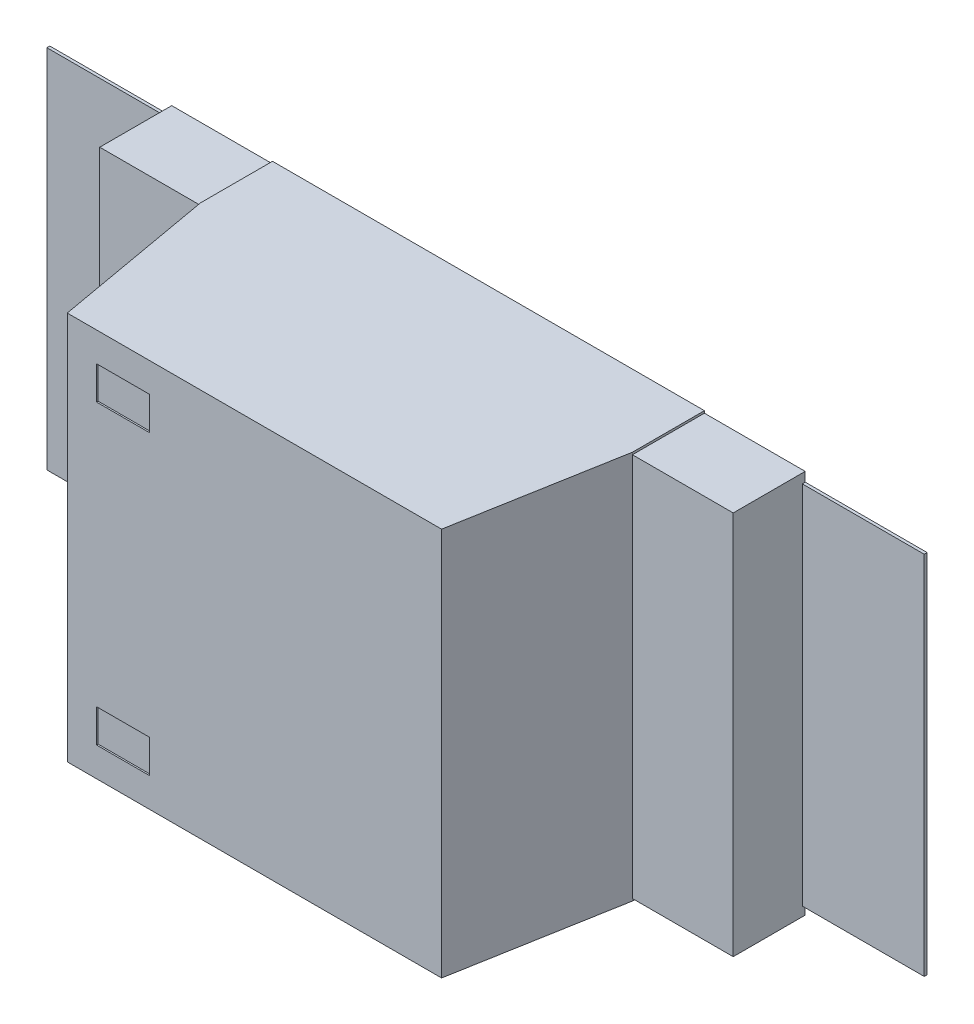
ISO-10303-21;
HEADER;
FILE_DESCRIPTION(('STEP AP214'),'2;1');
FILE_NAME('part.step','',(''),(''),'','','');
FILE_SCHEMA(('AUTOMOTIVE_DESIGN { 1 0 10303 214 1 1 1 1 }'));
ENDSEC;
DATA;
#1=APPLICATION_CONTEXT('core data for automotive mechanical design processes');
#2=APPLICATION_PROTOCOL_DEFINITION('international standard','automotive_design',2000,#1);
#3=PRODUCT_CONTEXT('',#1,'mechanical');
#4=PRODUCT('Part','Part','',(#3));
#5=PRODUCT_RELATED_PRODUCT_CATEGORY('part','',(#4));
#6=PRODUCT_DEFINITION_FORMATION('','',#4);
#7=PRODUCT_DEFINITION_CONTEXT('part definition',#1,'design');
#8=PRODUCT_DEFINITION('design','',#6,#7);
#9=PRODUCT_DEFINITION_SHAPE('','',#8);
#10=(LENGTH_UNIT() NAMED_UNIT(*) SI_UNIT(.MILLI.,.METRE.));
#11=(NAMED_UNIT(*) PLANE_ANGLE_UNIT() SI_UNIT($,.RADIAN.));
#12=(NAMED_UNIT(*) SI_UNIT($,.STERADIAN.) SOLID_ANGLE_UNIT());
#13=UNCERTAINTY_MEASURE_WITH_UNIT(LENGTH_MEASURE(1.E-05),#10,'distance_accuracy_value','');
#14=(GEOMETRIC_REPRESENTATION_CONTEXT(3) GLOBAL_UNCERTAINTY_ASSIGNED_CONTEXT((#13)) GLOBAL_UNIT_ASSIGNED_CONTEXT((#10,
#11,#12)) REPRESENTATION_CONTEXT('',''));
#15=CARTESIAN_POINT('',(0.,0.,0.));
#16=DIRECTION('',(0.,0.,1.));
#17=DIRECTION('',(1.,0.,0.));
#18=AXIS2_PLACEMENT_3D('',#15,#16,#17);
#19=CARTESIAN_POINT('',(-1.09999999999992,0.67499999999984,0.326200000000016));
#20=DIRECTION('',(0.,0.,1.));
#21=DIRECTION('',(1.,0.,0.));
#22=AXIS2_PLACEMENT_3D('',#19,#20,#21);
#23=PLANE('',#22);
#24=DIRECTION('',(1.,0.,0.));
#25=VECTOR('',#24,1.);
#26=CARTESIAN_POINT('',(-1.09999999999992,0.66737999999984,0.326200000000016));
#27=LINE('',#26,#25);
#28=CARTESIAN_POINT('',(-0.750000000000048,0.66737999999984,0.326200000000016));
#29=VERTEX_POINT('',#28);
#30=CARTESIAN_POINT('',(-1.09999999999992,0.66737999999984,0.326200000000016));
#31=VERTEX_POINT('',#30);
#32=EDGE_CURVE('E219',#29,#31,#27,.F.);
#33=ORIENTED_EDGE('',*,*,#32,.T.);
#34=DIRECTION('',(0.,1.,0.));
#35=VECTOR('',#34,1.);
#36=CARTESIAN_POINT('',(-1.09999999999992,0.67499999999984,0.326200000000016));
#37=LINE('',#36,#35);
#38=CARTESIAN_POINT('',(-1.09999999999992,-0.66737999999984,0.326200000000016));
#39=VERTEX_POINT('',#38);
#40=EDGE_CURVE('E239',#39,#31,#37,.T.);
#41=ORIENTED_EDGE('',*,*,#40,.F.);
#42=DIRECTION('',(1.,0.,0.));
#43=VECTOR('',#42,1.);
#44=CARTESIAN_POINT('',(-1.09999999999992,-0.66737999999984,0.326200000000016));
#45=LINE('',#44,#43);
#46=CARTESIAN_POINT('',(-0.750000000000048,-0.66737999999984,0.326200000000016));
#47=VERTEX_POINT('',#46);
#48=EDGE_CURVE('E19',#39,#47,#45,.T.);
#49=ORIENTED_EDGE('',*,*,#48,.T.);
#50=DIRECTION('',(0.,1.,0.));
#51=VECTOR('',#50,1.);
#52=CARTESIAN_POINT('',(-0.750000000000048,0.67499999999984,0.326200000000016));
#53=LINE('',#52,#51);
#54=EDGE_CURVE('E249',#29,#47,#53,.F.);
#55=ORIENTED_EDGE('',*,*,#54,.F.);
#56=EDGE_LOOP('',(#33,#41,#49,#55));
#57=FACE_BOUND('',#56,.T.);
#58=ADVANCED_FACE('F16',(#57),#23,.T.);
#59=CARTESIAN_POINT('',(0.,0.67499999999984,0.883666));
#60=DIRECTION('',(0.,0.,1.));
#61=DIRECTION('',(1.,0.,0.));
#62=AXIS2_PLACEMENT_3D('',#59,#60,#61);
#63=PLANE('',#62);
#64=DIRECTION('',(1.,0.,0.));
#65=VECTOR('',#64,1.);
#66=CARTESIAN_POINT('',(-0.36374199999994,0.57339999999984,0.883666));
#67=LINE('',#66,#65);
#68=CARTESIAN_POINT('',(-0.36374199999994,0.57339999999984,0.883666));
#69=VERTEX_POINT('',#68);
#70=CARTESIAN_POINT('',(-0.54839999999994,0.57339999999984,0.883666));
#71=VERTEX_POINT('',#70);
#72=EDGE_CURVE('E419',#69,#71,#67,.F.);
#73=ORIENTED_EDGE('',*,*,#72,.T.);
#74=DIRECTION('',(0.,1.,0.));
#75=VECTOR('',#74,1.);
#76=CARTESIAN_POINT('',(-0.54839999999994,0.57339999999984,0.883666));
#77=LINE('',#76,#75);
#78=CARTESIAN_POINT('',(-0.54839999999994,0.45808399999984,0.883666));
#79=VERTEX_POINT('',#78);
#80=EDGE_CURVE('E401',#71,#79,#77,.F.);
#81=ORIENTED_EDGE('',*,*,#80,.T.);
#82=DIRECTION('',(1.,0.,0.));
#83=VECTOR('',#82,1.);
#84=CARTESIAN_POINT('',(-0.54839999999994,0.45808399999984,0.883666));
#85=LINE('',#84,#83);
#86=CARTESIAN_POINT('',(-0.36374199999994,0.45808399999984,0.883666));
#87=VERTEX_POINT('',#86);
#88=EDGE_CURVE('E410',#79,#87,#85,.T.);
#89=ORIENTED_EDGE('',*,*,#88,.T.);
#90=DIRECTION('',(0.,1.,0.));
#91=VECTOR('',#90,1.);
#92=CARTESIAN_POINT('',(-0.36374199999994,0.45808399999984,0.883666));
#93=LINE('',#92,#91);
#94=EDGE_CURVE('E416',#87,#69,#93,.T.);
#95=ORIENTED_EDGE('',*,*,#94,.T.);
#96=EDGE_LOOP('',(#73,#81,#89,#95));
#97=FACE_BOUND('',#96,.T.);
#98=ADVANCED_FACE('F628',(#97),#63,.T.);
#99=CARTESIAN_POINT('',(0.,0.67499999999984,0.883666));
#100=DIRECTION('',(0.,0.,1.));
#101=DIRECTION('',(1.,0.,0.));
#102=AXIS2_PLACEMENT_3D('',#99,#100,#101);
#103=PLANE('',#102);
#104=DIRECTION('',(1.,0.,0.));
#105=VECTOR('',#104,1.);
#106=CARTESIAN_POINT('',(-0.36374199999994,-0.45808399999984,0.883666));
#107=LINE('',#106,#105);
#108=CARTESIAN_POINT('',(-0.36374199999994,-0.45808399999984,0.883666));
#109=VERTEX_POINT('',#108);
#110=CARTESIAN_POINT('',(-0.54839999999994,-0.45808399999984,0.883666));
#111=VERTEX_POINT('',#110);
#112=EDGE_CURVE('E396',#109,#111,#107,.F.);
#113=ORIENTED_EDGE('',*,*,#112,.T.);
#114=DIRECTION('',(0.,1.,0.));
#115=VECTOR('',#114,1.);
#116=CARTESIAN_POINT('',(-0.54839999999994,-0.45808399999984,0.883666));
#117=LINE('',#116,#115);
#118=CARTESIAN_POINT('',(-0.54839999999994,-0.57339999999984,0.883666));
#119=VERTEX_POINT('',#118);
#120=EDGE_CURVE('E378',#111,#119,#117,.F.);
#121=ORIENTED_EDGE('',*,*,#120,.T.);
#122=DIRECTION('',(1.,0.,0.));
#123=VECTOR('',#122,1.);
#124=CARTESIAN_POINT('',(-0.54839999999994,-0.57339999999984,0.883666));
#125=LINE('',#124,#123);
#126=CARTESIAN_POINT('',(-0.36374199999994,-0.57339999999984,0.883666));
#127=VERTEX_POINT('',#126);
#128=EDGE_CURVE('E387',#119,#127,#125,.T.);
#129=ORIENTED_EDGE('',*,*,#128,.T.);
#130=DIRECTION('',(0.,1.,0.));
#131=VECTOR('',#130,1.);
#132=CARTESIAN_POINT('',(-0.36374199999994,-0.57339999999984,0.883666));
#133=LINE('',#132,#131);
#134=EDGE_CURVE('E393',#127,#109,#133,.T.);
#135=ORIENTED_EDGE('',*,*,#134,.T.);
#136=EDGE_LOOP('',(#113,#121,#129,#135));
#137=FACE_BOUND('',#136,.T.);
#138=ADVANCED_FACE('F626',(#137),#103,.T.);
#139=CARTESIAN_POINT('',(-1.09999999999992,0.67499999999984,0.0762));
#140=DIRECTION('',(-1.,0.,0.));
#141=DIRECTION('',(0.,0.,1.));
#142=AXIS2_PLACEMENT_3D('',#139,#140,#141);
#143=PLANE('',#142);
#144=DIRECTION('',(0.,0.,1.));
#145=VECTOR('',#144,1.);
#146=CARTESIAN_POINT('',(-1.09999999999992,0.635,0.0762));
#147=LINE('',#146,#145);
#148=CARTESIAN_POINT('',(-1.09999999999992,0.635,0.0762));
#149=VERTEX_POINT('',#148);
#150=CARTESIAN_POINT('',(-1.09999999999992,0.635,0.08636));
#151=VERTEX_POINT('',#150);
#152=EDGE_CURVE('E279',#149,#151,#147,.T.);
#153=ORIENTED_EDGE('',*,*,#152,.T.);
#154=DIRECTION('',(0.,1.,0.));
#155=VECTOR('',#154,1.);
#156=CARTESIAN_POINT('',(-1.09999999999992,0.,0.08636));
#157=LINE('',#156,#155);
#158=CARTESIAN_POINT('',(-1.09999999999992,-0.635,0.08636));
#159=VERTEX_POINT('',#158);
#160=EDGE_CURVE('E216',#159,#151,#157,.T.);
#161=ORIENTED_EDGE('',*,*,#160,.F.);
#162=DIRECTION('',(0.,0.,1.));
#163=VECTOR('',#162,1.);
#164=CARTESIAN_POINT('',(-1.09999999999992,-0.635,0.0762));
#165=LINE('',#164,#163);
#166=CARTESIAN_POINT('',(-1.09999999999992,-0.635,0.0762));
#167=VERTEX_POINT('',#166);
#168=EDGE_CURVE('E212',#159,#167,#165,.F.);
#169=ORIENTED_EDGE('',*,*,#168,.T.);
#170=DIRECTION('',(0.,1.,0.));
#171=VECTOR('',#170,1.);
#172=CARTESIAN_POINT('',(-1.09999999999992,0.67499999999984,0.0762));
#173=LINE('',#172,#171);
#174=CARTESIAN_POINT('',(-1.09999999999992,-0.66737999999984,0.0762));
#175=VERTEX_POINT('',#174);
#176=EDGE_CURVE('E209',#167,#175,#173,.F.);
#177=ORIENTED_EDGE('',*,*,#176,.T.);
#178=DIRECTION('',(0.,0.,1.));
#179=VECTOR('',#178,1.);
#180=CARTESIAN_POINT('',(-1.09999999999992,-0.66737999999984,0.0762));
#181=LINE('',#180,#179);
#182=EDGE_CURVE('E237',#175,#39,#181,.T.);
#183=ORIENTED_EDGE('',*,*,#182,.T.);
#184=ORIENTED_EDGE('',*,*,#40,.T.);
#185=DIRECTION('',(0.,0.,1.));
#186=VECTOR('',#185,1.);
#187=CARTESIAN_POINT('',(-1.09999999999992,0.66737999999984,0.0762));
#188=LINE('',#187,#186);
#189=CARTESIAN_POINT('',(-1.09999999999992,0.66737999999984,0.0762));
#190=VERTEX_POINT('',#189);
#191=EDGE_CURVE('E283',#31,#190,#188,.F.);
#192=ORIENTED_EDGE('',*,*,#191,.T.);
#193=DIRECTION('',(0.,1.,0.));
#194=VECTOR('',#193,1.);
#195=CARTESIAN_POINT('',(-1.09999999999992,0.67499999999984,0.0762));
#196=LINE('',#195,#194);
#197=EDGE_CURVE('E281',#190,#149,#196,.F.);
#198=ORIENTED_EDGE('',*,*,#197,.T.);
#199=EDGE_LOOP('',(#153,#161,#169,#177,#183,#184,#192,#198));
#200=FACE_BOUND('',#199,.T.);
#201=ADVANCED_FACE('F214',(#200),#143,.T.);
#202=CARTESIAN_POINT('',(-0.750000000000048,0.67499999999984,0.326200000000016));
#203=DIRECTION('',(-0.984578582633507,0.,0.174942889593701));
#204=DIRECTION('',(0.174942889593701,0.,0.984578582633507));
#205=AXIS2_PLACEMENT_3D('',#202,#203,#204);
#206=PLANE('',#205);
#207=DIRECTION('',(0.,1.,0.));
#208=VECTOR('',#207,1.);
#209=CARTESIAN_POINT('',(-0.750000000000048,0.67499999999984,0.326200000000016));
#210=LINE('',#209,#208);
#211=CARTESIAN_POINT('',(-0.750000000000048,-0.67499999999984,0.326200000000016));
#212=VERTEX_POINT('',#211);
#213=EDGE_CURVE('E255',#47,#212,#210,.F.);
#214=ORIENTED_EDGE('',*,*,#213,.T.);
#215=DIRECTION('',(0.174942889593701,0.,0.984578582633507));
#216=VECTOR('',#215,1.);
#217=CARTESIAN_POINT('',(-0.750000000000048,-0.67499999999984,0.326200000000016));
#218=LINE('',#217,#216);
#219=CARTESIAN_POINT('',(-0.650000000000001,-0.67499999999984,0.889000000000011));
#220=VERTEX_POINT('',#219);
#221=EDGE_CURVE('E270',#212,#220,#218,.T.);
#222=ORIENTED_EDGE('',*,*,#221,.T.);
#223=DIRECTION('',(0.,1.,0.));
#224=VECTOR('',#223,1.);
#225=CARTESIAN_POINT('',(-0.64999999999994,0.67499999999984,0.889));
#226=LINE('',#225,#224);
#227=CARTESIAN_POINT('',(-0.650000000000001,0.67499999999984,0.889000000000011));
#228=VERTEX_POINT('',#227);
#229=EDGE_CURVE('E309',#228,#220,#226,.F.);
#230=ORIENTED_EDGE('',*,*,#229,.F.);
#231=DIRECTION('',(0.174942889593701,0.,0.984578582633507));
#232=VECTOR('',#231,1.);
#233=CARTESIAN_POINT('',(-0.750000000000048,0.67499999999984,0.326200000000016));
#234=LINE('',#233,#232);
#235=CARTESIAN_POINT('',(-0.750000000000048,0.67499999999984,0.326200000000016));
#236=VERTEX_POINT('',#235);
#237=EDGE_CURVE('E277',#228,#236,#234,.F.);
#238=ORIENTED_EDGE('',*,*,#237,.T.);
#239=DIRECTION('',(0.,1.,0.));
#240=VECTOR('',#239,1.);
#241=CARTESIAN_POINT('',(-0.750000000000048,0.67499999999984,0.326200000000016));
#242=LINE('',#241,#240);
#243=EDGE_CURVE('E258',#236,#29,#242,.F.);
#244=ORIENTED_EDGE('',*,*,#243,.T.);
#245=ORIENTED_EDGE('',*,*,#54,.T.);
#246=EDGE_LOOP('',(#214,#222,#230,#238,#244,#245));
#247=FACE_BOUND('',#246,.T.);
#248=ADVANCED_FACE('F253',(#247),#206,.T.);
#249=CARTESIAN_POINT('',(0.64999999999994,0.67499999999984,0.889));
#250=DIRECTION('',(0.984578582633507,0.,0.174942889593701));
#251=DIRECTION('',(0.174942889593701,0.,-0.984578582633507));
#252=AXIS2_PLACEMENT_3D('',#249,#250,#251);
#253=PLANE('',#252);
#254=DIRECTION('',(0.,1.,0.));
#255=VECTOR('',#254,1.);
#256=CARTESIAN_POINT('',(0.64999999999994,0.67499999999984,0.889));
#257=LINE('',#256,#255);
#258=CARTESIAN_POINT('',(0.64999999999994,-0.67499999999984,0.889));
#259=VERTEX_POINT('',#258);
#260=CARTESIAN_POINT('',(0.64999999999994,0.67499999999984,0.889));
#261=VERTEX_POINT('',#260);
#262=EDGE_CURVE('E364',#259,#261,#257,.T.);
#263=ORIENTED_EDGE('',*,*,#262,.F.);
#264=DIRECTION('',(0.174942889593701,0.,-0.984578582633507));
#265=VECTOR('',#264,1.);
#266=CARTESIAN_POINT('',(0.64999999999994,-0.67499999999984,0.889));
#267=LINE('',#266,#265);
#268=CARTESIAN_POINT('',(0.749999999999987,-0.67499999999984,0.326200000000005));
#269=VERTEX_POINT('',#268);
#270=EDGE_CURVE('E421',#259,#269,#267,.T.);
#271=ORIENTED_EDGE('',*,*,#270,.T.);
#272=DIRECTION('',(0.,1.,0.));
#273=VECTOR('',#272,1.);
#274=CARTESIAN_POINT('',(0.749999999999925,0.67499999999984,0.326199999999994));
#275=LINE('',#274,#273);
#276=CARTESIAN_POINT('',(0.749999999999987,-0.66737999999984,0.326200000000005));
#277=VERTEX_POINT('',#276);
#278=EDGE_CURVE('E272',#269,#277,#275,.T.);
#279=ORIENTED_EDGE('',*,*,#278,.T.);
#280=DIRECTION('',(0.,1.,0.));
#281=VECTOR('',#280,1.);
#282=CARTESIAN_POINT('',(0.750000000000048,0.67499999999984,0.326200000000016));
#283=LINE('',#282,#281);
#284=CARTESIAN_POINT('',(0.750000000000017,0.66737999999984,0.326200000000011));
#285=VERTEX_POINT('',#284);
#286=EDGE_CURVE('E370',#285,#277,#283,.F.);
#287=ORIENTED_EDGE('',*,*,#286,.F.);
#288=DIRECTION('',(0.,1.,0.));
#289=VECTOR('',#288,1.);
#290=CARTESIAN_POINT('',(0.749999999999925,0.67499999999984,0.326199999999994));
#291=LINE('',#290,#289);
#292=CARTESIAN_POINT('',(0.749999999999987,0.67499999999984,0.326200000000005));
#293=VERTEX_POINT('',#292);
#294=EDGE_CURVE('E425',#285,#293,#291,.T.);
#295=ORIENTED_EDGE('',*,*,#294,.T.);
#296=DIRECTION('',(0.174942889593701,0.,-0.984578582633507));
#297=VECTOR('',#296,1.);
#298=CARTESIAN_POINT('',(0.64999999999994,0.67499999999984,0.889));
#299=LINE('',#298,#297);
#300=EDGE_CURVE('E423',#293,#261,#299,.F.);
#301=ORIENTED_EDGE('',*,*,#300,.T.);
#302=EDGE_LOOP('',(#263,#271,#279,#287,#295,#301));
#303=FACE_BOUND('',#302,.T.);
#304=ADVANCED_FACE('F430',(#303),#253,.T.);
#305=CARTESIAN_POINT('',(-0.36374199999994,0.57339999999984,0.889));
#306=DIRECTION('',(0.,1.,0.));
#307=DIRECTION('',(0.,0.,1.));
#308=AXIS2_PLACEMENT_3D('',#305,#306,#307);
#309=PLANE('',#308);
#310=ORIENTED_EDGE('',*,*,#72,.F.);
#311=DIRECTION('',(0.,0.,-1.));
#312=VECTOR('',#311,1.);
#313=CARTESIAN_POINT('',(-0.36374199999994,0.57339999999984,0.889));
#314=LINE('',#313,#312);
#315=CARTESIAN_POINT('',(-0.36374199999994,0.57339999999984,0.889));
#316=VERTEX_POINT('',#315);
#317=EDGE_CURVE('E413',#69,#316,#314,.F.);
#318=ORIENTED_EDGE('',*,*,#317,.T.);
#319=DIRECTION('',(1.,0.,0.));
#320=VECTOR('',#319,1.);
#321=CARTESIAN_POINT('',(-0.64999999999994,0.57339999999984,0.889));
#322=LINE('',#321,#320);
#323=CARTESIAN_POINT('',(-0.54839999999994,0.57339999999984,0.889));
#324=VERTEX_POINT('',#323);
#325=EDGE_CURVE('E362',#324,#316,#322,.T.);
#326=ORIENTED_EDGE('',*,*,#325,.F.);
#327=DIRECTION('',(0.,0.,1.));
#328=VECTOR('',#327,1.);
#329=CARTESIAN_POINT('',(-0.54839999999994,0.57339999999984,0.889));
#330=LINE('',#329,#328);
#331=EDGE_CURVE('E404',#324,#71,#330,.F.);
#332=ORIENTED_EDGE('',*,*,#331,.T.);
#333=EDGE_LOOP('',(#310,#318,#326,#332));
#334=FACE_BOUND('',#333,.T.);
#335=ADVANCED_FACE('F615',(#334),#309,.F.);
#336=CARTESIAN_POINT('',(-0.36374199999994,0.45808399999984,0.889));
#337=DIRECTION('',(1.,0.,0.));
#338=DIRECTION('',(0.,0.,-1.));
#339=AXIS2_PLACEMENT_3D('',#336,#337,#338);
#340=PLANE('',#339);
#341=ORIENTED_EDGE('',*,*,#94,.F.);
#342=DIRECTION('',(0.,0.,-1.));
#343=VECTOR('',#342,1.);
#344=CARTESIAN_POINT('',(-0.36374199999994,0.45808399999984,0.889));
#345=LINE('',#344,#343);
#346=CARTESIAN_POINT('',(-0.36374199999994,0.45808399999984,0.889));
#347=VERTEX_POINT('',#346);
#348=EDGE_CURVE('E407',#87,#347,#345,.F.);
#349=ORIENTED_EDGE('',*,*,#348,.T.);
#350=DIRECTION('',(0.,1.,0.));
#351=VECTOR('',#350,1.);
#352=CARTESIAN_POINT('',(-0.36374199999994,0.67499999999984,0.889));
#353=LINE('',#352,#351);
#354=EDGE_CURVE('E360',#316,#347,#353,.F.);
#355=ORIENTED_EDGE('',*,*,#354,.F.);
#356=ORIENTED_EDGE('',*,*,#317,.F.);
#357=EDGE_LOOP('',(#341,#349,#355,#356));
#358=FACE_BOUND('',#357,.T.);
#359=ADVANCED_FACE('F611',(#358),#340,.F.);
#360=CARTESIAN_POINT('',(-0.54839999999994,0.45808399999984,0.889));
#361=DIRECTION('',(0.,-1.,0.));
#362=DIRECTION('',(0.,0.,-1.));
#363=AXIS2_PLACEMENT_3D('',#360,#361,#362);
#364=PLANE('',#363);
#365=ORIENTED_EDGE('',*,*,#88,.F.);
#366=DIRECTION('',(0.,0.,1.));
#367=VECTOR('',#366,1.);
#368=CARTESIAN_POINT('',(-0.54839999999994,0.45808399999984,0.889));
#369=LINE('',#368,#367);
#370=CARTESIAN_POINT('',(-0.54839999999994,0.45808399999984,0.889));
#371=VERTEX_POINT('',#370);
#372=EDGE_CURVE('E398',#79,#371,#369,.T.);
#373=ORIENTED_EDGE('',*,*,#372,.T.);
#374=DIRECTION('',(1.,0.,0.));
#375=VECTOR('',#374,1.);
#376=CARTESIAN_POINT('',(-0.64999999999994,0.45808399999984,0.889));
#377=LINE('',#376,#375);
#378=EDGE_CURVE('E358',#347,#371,#377,.F.);
#379=ORIENTED_EDGE('',*,*,#378,.F.);
#380=ORIENTED_EDGE('',*,*,#348,.F.);
#381=EDGE_LOOP('',(#365,#373,#379,#380));
#382=FACE_BOUND('',#381,.T.);
#383=ADVANCED_FACE('F607',(#382),#364,.F.);
#384=CARTESIAN_POINT('',(-0.54839999999994,0.57339999999984,0.889));
#385=DIRECTION('',(-1.,0.,0.));
#386=DIRECTION('',(0.,0.,1.));
#387=AXIS2_PLACEMENT_3D('',#384,#385,#386);
#388=PLANE('',#387);
#389=ORIENTED_EDGE('',*,*,#80,.F.);
#390=ORIENTED_EDGE('',*,*,#331,.F.);
#391=DIRECTION('',(0.,1.,0.));
#392=VECTOR('',#391,1.);
#393=CARTESIAN_POINT('',(-0.54839999999994,0.67499999999984,0.889));
#394=LINE('',#393,#392);
#395=EDGE_CURVE('E355',#371,#324,#394,.T.);
#396=ORIENTED_EDGE('',*,*,#395,.F.);
#397=ORIENTED_EDGE('',*,*,#372,.F.);
#398=EDGE_LOOP('',(#389,#390,#396,#397));
#399=FACE_BOUND('',#398,.T.);
#400=ADVANCED_FACE('F603',(#399),#388,.F.);
#401=CARTESIAN_POINT('',(-0.36374199999994,-0.45808399999984,0.889));
#402=DIRECTION('',(0.,1.,0.));
#403=DIRECTION('',(0.,0.,1.));
#404=AXIS2_PLACEMENT_3D('',#401,#402,#403);
#405=PLANE('',#404);
#406=ORIENTED_EDGE('',*,*,#112,.F.);
#407=DIRECTION('',(0.,0.,-1.));
#408=VECTOR('',#407,1.);
#409=CARTESIAN_POINT('',(-0.36374199999994,-0.45808399999984,0.889));
#410=LINE('',#409,#408);
#411=CARTESIAN_POINT('',(-0.36374199999994,-0.45808399999984,0.889));
#412=VERTEX_POINT('',#411);
#413=EDGE_CURVE('E390',#109,#412,#410,.F.);
#414=ORIENTED_EDGE('',*,*,#413,.T.);
#415=DIRECTION('',(1.,0.,0.));
#416=VECTOR('',#415,1.);
#417=CARTESIAN_POINT('',(-0.64999999999994,-0.45808399999984,0.889));
#418=LINE('',#417,#416);
#419=CARTESIAN_POINT('',(-0.54839999999994,-0.45808399999984,0.889));
#420=VERTEX_POINT('',#419);
#421=EDGE_CURVE('E353',#420,#412,#418,.T.);
#422=ORIENTED_EDGE('',*,*,#421,.F.);
#423=DIRECTION('',(0.,0.,1.));
#424=VECTOR('',#423,1.);
#425=CARTESIAN_POINT('',(-0.54839999999994,-0.45808399999984,0.889));
#426=LINE('',#425,#424);
#427=EDGE_CURVE('E381',#420,#111,#426,.F.);
#428=ORIENTED_EDGE('',*,*,#427,.T.);
#429=EDGE_LOOP('',(#406,#414,#422,#428));
#430=FACE_BOUND('',#429,.T.);
#431=ADVANCED_FACE('F599',(#430),#405,.F.);
#432=CARTESIAN_POINT('',(-0.36374199999994,-0.57339999999984,0.889));
#433=DIRECTION('',(1.,0.,0.));
#434=DIRECTION('',(0.,0.,-1.));
#435=AXIS2_PLACEMENT_3D('',#432,#433,#434);
#436=PLANE('',#435);
#437=ORIENTED_EDGE('',*,*,#134,.F.);
#438=DIRECTION('',(0.,0.,-1.));
#439=VECTOR('',#438,1.);
#440=CARTESIAN_POINT('',(-0.36374199999994,-0.57339999999984,0.889));
#441=LINE('',#440,#439);
#442=CARTESIAN_POINT('',(-0.36374199999994,-0.57339999999984,0.889));
#443=VERTEX_POINT('',#442);
#444=EDGE_CURVE('E384',#127,#443,#441,.F.);
#445=ORIENTED_EDGE('',*,*,#444,.T.);
#446=DIRECTION('',(0.,1.,0.));
#447=VECTOR('',#446,1.);
#448=CARTESIAN_POINT('',(-0.36374199999994,0.67499999999984,0.889));
#449=LINE('',#448,#447);
#450=EDGE_CURVE('E351',#412,#443,#449,.F.);
#451=ORIENTED_EDGE('',*,*,#450,.F.);
#452=ORIENTED_EDGE('',*,*,#413,.F.);
#453=EDGE_LOOP('',(#437,#445,#451,#452));
#454=FACE_BOUND('',#453,.T.);
#455=ADVANCED_FACE('F595',(#454),#436,.F.);
#456=CARTESIAN_POINT('',(-0.54839999999994,-0.57339999999984,0.889));
#457=DIRECTION('',(0.,-1.,0.));
#458=DIRECTION('',(0.,0.,-1.));
#459=AXIS2_PLACEMENT_3D('',#456,#457,#458);
#460=PLANE('',#459);
#461=ORIENTED_EDGE('',*,*,#128,.F.);
#462=DIRECTION('',(0.,0.,1.));
#463=VECTOR('',#462,1.);
#464=CARTESIAN_POINT('',(-0.54839999999994,-0.57339999999984,0.889));
#465=LINE('',#464,#463);
#466=CARTESIAN_POINT('',(-0.54839999999994,-0.57339999999984,0.889));
#467=VERTEX_POINT('',#466);
#468=EDGE_CURVE('E375',#119,#467,#465,.T.);
#469=ORIENTED_EDGE('',*,*,#468,.T.);
#470=DIRECTION('',(1.,0.,0.));
#471=VECTOR('',#470,1.);
#472=CARTESIAN_POINT('',(-0.64999999999994,-0.57339999999984,0.889));
#473=LINE('',#472,#471);
#474=EDGE_CURVE('E349',#443,#467,#473,.F.);
#475=ORIENTED_EDGE('',*,*,#474,.F.);
#476=ORIENTED_EDGE('',*,*,#444,.F.);
#477=EDGE_LOOP('',(#461,#469,#475,#476));
#478=FACE_BOUND('',#477,.T.);
#479=ADVANCED_FACE('F591',(#478),#460,.F.);
#480=CARTESIAN_POINT('',(-0.54839999999994,-0.45808399999984,0.889));
#481=DIRECTION('',(-1.,0.,0.));
#482=DIRECTION('',(0.,0.,1.));
#483=AXIS2_PLACEMENT_3D('',#480,#481,#482);
#484=PLANE('',#483);
#485=ORIENTED_EDGE('',*,*,#120,.F.);
#486=ORIENTED_EDGE('',*,*,#427,.F.);
#487=DIRECTION('',(0.,1.,0.));
#488=VECTOR('',#487,1.);
#489=CARTESIAN_POINT('',(-0.54839999999994,0.67499999999984,0.889));
#490=LINE('',#489,#488);
#491=EDGE_CURVE('E346',#467,#420,#490,.T.);
#492=ORIENTED_EDGE('',*,*,#491,.F.);
#493=ORIENTED_EDGE('',*,*,#468,.F.);
#494=EDGE_LOOP('',(#485,#486,#492,#493));
#495=FACE_BOUND('',#494,.T.);
#496=ADVANCED_FACE('F588',(#495),#484,.F.);
#497=CARTESIAN_POINT('',(0.750000000000048,0.67499999999984,0.326200000000016));
#498=DIRECTION('',(0.,0.,1.));
#499=DIRECTION('',(1.,0.,0.));
#500=AXIS2_PLACEMENT_3D('',#497,#498,#499);
#501=PLANE('',#500);
#502=DIRECTION('',(1.,0.,0.));
#503=VECTOR('',#502,1.);
#504=CARTESIAN_POINT('',(0.750000000000048,-0.66737999999984,0.326200000000016));
#505=LINE('',#504,#503);
#506=CARTESIAN_POINT('',(1.09999999999992,-0.66737999999984,0.326200000000016));
#507=VERTEX_POINT('',#506);
#508=EDGE_CURVE('E310',#277,#507,#505,.T.);
#509=ORIENTED_EDGE('',*,*,#508,.T.);
#510=DIRECTION('',(0.,1.,0.));
#511=VECTOR('',#510,1.);
#512=CARTESIAN_POINT('',(1.09999999999992,0.67499999999984,0.326200000000016));
#513=LINE('',#512,#511);
#514=CARTESIAN_POINT('',(1.09999999999992,0.66737999999984,0.326200000000016));
#515=VERTEX_POINT('',#514);
#516=EDGE_CURVE('E339',#515,#507,#513,.F.);
#517=ORIENTED_EDGE('',*,*,#516,.F.);
#518=DIRECTION('',(1.,0.,0.));
#519=VECTOR('',#518,1.);
#520=CARTESIAN_POINT('',(0.750000000000048,0.66737999999984,0.326200000000016));
#521=LINE('',#520,#519);
#522=EDGE_CURVE('E373',#515,#285,#521,.F.);
#523=ORIENTED_EDGE('',*,*,#522,.T.);
#524=ORIENTED_EDGE('',*,*,#286,.T.);
#525=EDGE_LOOP('',(#509,#517,#523,#524));
#526=FACE_BOUND('',#525,.T.);
#527=ADVANCED_FACE('F435',(#526),#501,.T.);
#528=CARTESIAN_POINT('',(0.,0.,0.08636));
#529=DIRECTION('',(0.,0.,1.));
#530=DIRECTION('',(1.,0.,0.));
#531=AXIS2_PLACEMENT_3D('',#528,#529,#530);
#532=PLANE('',#531);
#533=DIRECTION('',(1.,0.,0.));
#534=VECTOR('',#533,1.);
#535=CARTESIAN_POINT('',(-1.523492,-0.635,0.08636));
#536=LINE('',#535,#534);
#537=CARTESIAN_POINT('',(-1.523492,-0.635,0.08636));
#538=VERTEX_POINT('',#537);
#539=EDGE_CURVE('E308',#159,#538,#536,.F.);
#540=ORIENTED_EDGE('',*,*,#539,.F.);
#541=ORIENTED_EDGE('',*,*,#160,.T.);
#542=DIRECTION('',(1.,0.,0.));
#543=VECTOR('',#542,1.);
#544=CARTESIAN_POINT('',(-0.380492,0.635,0.08636));
#545=LINE('',#544,#543);
#546=CARTESIAN_POINT('',(-1.523492,0.635,0.08636));
#547=VERTEX_POINT('',#546);
#548=EDGE_CURVE('E306',#547,#151,#545,.T.);
#549=ORIENTED_EDGE('',*,*,#548,.F.);
#550=DIRECTION('',(0.,1.,0.));
#551=VECTOR('',#550,1.);
#552=CARTESIAN_POINT('',(-1.523492,0.635,0.08636));
#553=LINE('',#552,#551);
#554=EDGE_CURVE('E314',#538,#547,#553,.T.);
#555=ORIENTED_EDGE('',*,*,#554,.F.);
#556=EDGE_LOOP('',(#540,#541,#549,#555));
#557=FACE_BOUND('',#556,.T.);
#558=ADVANCED_FACE('F304',(#557),#532,.T.);
#559=CARTESIAN_POINT('',(-0.64999999999994,0.67499999999984,0.889));
#560=DIRECTION('',(0.,0.,1.));
#561=DIRECTION('',(1.,0.,0.));
#562=AXIS2_PLACEMENT_3D('',#559,#560,#561);
#563=PLANE('',#562);
#564=ORIENTED_EDGE('',*,*,#474,.T.);
#565=ORIENTED_EDGE('',*,*,#491,.T.);
#566=ORIENTED_EDGE('',*,*,#421,.T.);
#567=ORIENTED_EDGE('',*,*,#450,.T.);
#568=EDGE_LOOP('',(#564,#565,#566,#567));
#569=FACE_BOUND('',#568,.T.);
#570=ORIENTED_EDGE('',*,*,#378,.T.);
#571=ORIENTED_EDGE('',*,*,#395,.T.);
#572=ORIENTED_EDGE('',*,*,#325,.T.);
#573=ORIENTED_EDGE('',*,*,#354,.T.);
#574=EDGE_LOOP('',(#570,#571,#572,#573));
#575=FACE_BOUND('',#574,.T.);
#576=ORIENTED_EDGE('',*,*,#262,.T.);
#577=DIRECTION('',(1.,0.,0.));
#578=VECTOR('',#577,1.);
#579=CARTESIAN_POINT('',(0.,0.67499999999984,0.889));
#580=LINE('',#579,#578);
#581=EDGE_CURVE('E325',#228,#261,#580,.T.);
#582=ORIENTED_EDGE('',*,*,#581,.F.);
#583=ORIENTED_EDGE('',*,*,#229,.T.);
#584=DIRECTION('',(1.,0.,0.));
#585=VECTOR('',#584,1.);
#586=CARTESIAN_POINT('',(0.,-0.67499999999984,0.889));
#587=LINE('',#586,#585);
#588=EDGE_CURVE('E265',#220,#259,#587,.T.);
#589=ORIENTED_EDGE('',*,*,#588,.T.);
#590=EDGE_LOOP('',(#576,#582,#583,#589));
#591=FACE_BOUND('',#590,.T.);
#592=ADVANCED_FACE('F519',(#569,#575,#591),#563,.T.);
#593=CARTESIAN_POINT('',(0.,0.,0.08636));
#594=DIRECTION('',(0.,0.,1.));
#595=DIRECTION('',(1.,0.,0.));
#596=AXIS2_PLACEMENT_3D('',#593,#594,#595);
#597=PLANE('',#596);
#598=DIRECTION('',(1.,0.,0.));
#599=VECTOR('',#598,1.);
#600=CARTESIAN_POINT('',(1.523492,0.635,0.08636));
#601=LINE('',#600,#599);
#602=CARTESIAN_POINT('',(1.09999999999992,0.635,0.08636));
#603=VERTEX_POINT('',#602);
#604=CARTESIAN_POINT('',(1.523492,0.635,0.08636));
#605=VERTEX_POINT('',#604);
#606=EDGE_CURVE('E344',#603,#605,#601,.T.);
#607=ORIENTED_EDGE('',*,*,#606,.F.);
#608=DIRECTION('',(0.,1.,0.));
#609=VECTOR('',#608,1.);
#610=CARTESIAN_POINT('',(1.09999999999992,0.67499999999984,0.08636));
#611=LINE('',#610,#609);
#612=CARTESIAN_POINT('',(1.09999999999992,-0.635,0.08636));
#613=VERTEX_POINT('',#612);
#614=EDGE_CURVE('E334',#613,#603,#611,.T.);
#615=ORIENTED_EDGE('',*,*,#614,.F.);
#616=DIRECTION('',(1.,0.,0.));
#617=VECTOR('',#616,1.);
#618=CARTESIAN_POINT('',(0.380492,-0.635,0.08636));
#619=LINE('',#618,#617);
#620=CARTESIAN_POINT('',(1.523492,-0.635,0.08636));
#621=VERTEX_POINT('',#620);
#622=EDGE_CURVE('E446',#621,#613,#619,.F.);
#623=ORIENTED_EDGE('',*,*,#622,.F.);
#624=DIRECTION('',(0.,1.,0.));
#625=VECTOR('',#624,1.);
#626=CARTESIAN_POINT('',(1.523492,-0.635,0.08636));
#627=LINE('',#626,#625);
#628=EDGE_CURVE('E485',#605,#621,#627,.F.);
#629=ORIENTED_EDGE('',*,*,#628,.F.);
#630=EDGE_LOOP('',(#607,#615,#623,#629));
#631=FACE_BOUND('',#630,.T.);
#632=ADVANCED_FACE('F500',(#631),#597,.T.);
#633=CARTESIAN_POINT('',(1.523492,0.635,0.0762));
#634=DIRECTION('',(0.,1.,0.));
#635=DIRECTION('',(0.,0.,1.));
#636=AXIS2_PLACEMENT_3D('',#633,#634,#635);
#637=PLANE('',#636);
#638=DIRECTION('',(1.,0.,0.));
#639=VECTOR('',#638,1.);
#640=CARTESIAN_POINT('',(0.,0.635,0.0762));
#641=LINE('',#640,#639);
#642=CARTESIAN_POINT('',(1.523492,0.635,0.0762));
#643=VERTEX_POINT('',#642);
#644=CARTESIAN_POINT('',(1.09999999999992,0.635,0.0762));
#645=VERTEX_POINT('',#644);
#646=EDGE_CURVE('E481',#643,#645,#641,.F.);
#647=ORIENTED_EDGE('',*,*,#646,.T.);
#648=DIRECTION('',(0.,0.,-1.));
#649=VECTOR('',#648,1.);
#650=CARTESIAN_POINT('',(1.09999999999992,0.635,0.326200000000016));
#651=LINE('',#650,#649);
#652=EDGE_CURVE('E342',#603,#645,#651,.T.);
#653=ORIENTED_EDGE('',*,*,#652,.F.);
#654=ORIENTED_EDGE('',*,*,#606,.T.);
#655=DIRECTION('',(0.,0.,-1.));
#656=VECTOR('',#655,1.);
#657=CARTESIAN_POINT('',(1.523492,0.635,0.0762));
#658=LINE('',#657,#656);
#659=EDGE_CURVE('E487',#643,#605,#658,.F.);
#660=ORIENTED_EDGE('',*,*,#659,.F.);
#661=EDGE_LOOP('',(#647,#653,#654,#660));
#662=FACE_BOUND('',#661,.T.);
#663=ADVANCED_FACE('F536',(#662),#637,.T.);
#664=CARTESIAN_POINT('',(1.09999999999992,0.67499999999984,0.326200000000016));
#665=DIRECTION('',(1.,0.,0.));
#666=DIRECTION('',(0.,0.,-1.));
#667=AXIS2_PLACEMENT_3D('',#664,#665,#666);
#668=PLANE('',#667);
#669=DIRECTION('',(0.,0.,-1.));
#670=VECTOR('',#669,1.);
#671=CARTESIAN_POINT('',(1.09999999999992,-0.635,0.0762));
#672=LINE('',#671,#670);
#673=CARTESIAN_POINT('',(1.09999999999992,-0.635,0.0762));
#674=VERTEX_POINT('',#673);
#675=EDGE_CURVE('E490',#613,#674,#672,.T.);
#676=ORIENTED_EDGE('',*,*,#675,.F.);
#677=ORIENTED_EDGE('',*,*,#614,.T.);
#678=ORIENTED_EDGE('',*,*,#652,.T.);
#679=DIRECTION('',(0.,1.,0.));
#680=VECTOR('',#679,1.);
#681=CARTESIAN_POINT('',(1.09999999999992,0.,0.0762));
#682=LINE('',#681,#680);
#683=CARTESIAN_POINT('',(1.09999999999992,0.66737999999984,0.0762));
#684=VERTEX_POINT('',#683);
#685=EDGE_CURVE('E478',#645,#684,#682,.T.);
#686=ORIENTED_EDGE('',*,*,#685,.T.);
#687=DIRECTION('',(0.,0.,-1.));
#688=VECTOR('',#687,1.);
#689=CARTESIAN_POINT('',(1.09999999999992,0.66737999999984,0.0762));
#690=LINE('',#689,#688);
#691=EDGE_CURVE('E331',#684,#515,#690,.F.);
#692=ORIENTED_EDGE('',*,*,#691,.T.);
#693=ORIENTED_EDGE('',*,*,#516,.T.);
#694=DIRECTION('',(0.,0.,1.));
#695=VECTOR('',#694,1.);
#696=CARTESIAN_POINT('',(1.09999999999992,-0.66737999999984,0.0762));
#697=LINE('',#696,#695);
#698=CARTESIAN_POINT('',(1.09999999999992,-0.66737999999984,0.0762));
#699=VERTEX_POINT('',#698);
#700=EDGE_CURVE('E447',#507,#699,#697,.F.);
#701=ORIENTED_EDGE('',*,*,#700,.T.);
#702=DIRECTION('',(0.,1.,0.));
#703=VECTOR('',#702,1.);
#704=CARTESIAN_POINT('',(1.09999999999992,0.67499999999984,0.0762));
#705=LINE('',#704,#703);
#706=EDGE_CURVE('E337',#699,#674,#705,.T.);
#707=ORIENTED_EDGE('',*,*,#706,.T.);
#708=EDGE_LOOP('',(#676,#677,#678,#686,#692,#693,#701,#707));
#709=FACE_BOUND('',#708,.T.);
#710=ADVANCED_FACE('F502',(#709),#668,.T.);
#711=CARTESIAN_POINT('',(0.750000000000048,0.66737999999984,0.0762));
#712=DIRECTION('',(0.,-1.,0.));
#713=DIRECTION('',(0.,0.,-1.));
#714=AXIS2_PLACEMENT_3D('',#711,#712,#713);
#715=PLANE('',#714);
#716=DIRECTION('',(0.,0.,1.));
#717=VECTOR('',#716,1.);
#718=CARTESIAN_POINT('',(0.750000000000048,0.66737999999984,0.0762));
#719=LINE('',#718,#717);
#720=CARTESIAN_POINT('',(0.750000000000048,0.66737999999984,0.0762));
#721=VERTEX_POINT('',#720);
#722=EDGE_CURVE('E328',#721,#285,#719,.T.);
#723=ORIENTED_EDGE('',*,*,#722,.T.);
#724=ORIENTED_EDGE('',*,*,#522,.F.);
#725=ORIENTED_EDGE('',*,*,#691,.F.);
#726=DIRECTION('',(1.,0.,0.));
#727=VECTOR('',#726,1.);
#728=CARTESIAN_POINT('',(0.,0.66737999999984,0.0762));
#729=LINE('',#728,#727);
#730=EDGE_CURVE('E475',#684,#721,#729,.F.);
#731=ORIENTED_EDGE('',*,*,#730,.T.);
#732=EDGE_LOOP('',(#723,#724,#725,#731));
#733=FACE_BOUND('',#732,.T.);
#734=ADVANCED_FACE('F533',(#733),#715,.F.);
#735=CARTESIAN_POINT('',(0.750000000000048,0.67499999999984,0.0762));
#736=DIRECTION('',(-1.,0.,0.));
#737=DIRECTION('',(0.,0.,1.));
#738=AXIS2_PLACEMENT_3D('',#735,#736,#737);
#739=PLANE('',#738);
#740=ORIENTED_EDGE('',*,*,#722,.F.);
#741=DIRECTION('',(0.,1.,0.));
#742=VECTOR('',#741,1.);
#743=CARTESIAN_POINT('',(0.750000000000048,0.,0.0762));
#744=LINE('',#743,#742);
#745=CARTESIAN_POINT('',(0.750000000000048,0.67499999999984,0.0762));
#746=VERTEX_POINT('',#745);
#747=EDGE_CURVE('E472',#721,#746,#744,.T.);
#748=ORIENTED_EDGE('',*,*,#747,.T.);
#749=DIRECTION('',(0.,0.,1.));
#750=VECTOR('',#749,1.);
#751=CARTESIAN_POINT('',(0.750000000000048,0.67499999999984,0.));
#752=LINE('',#751,#750);
#753=EDGE_CURVE('E323',#293,#746,#752,.F.);
#754=ORIENTED_EDGE('',*,*,#753,.F.);
#755=ORIENTED_EDGE('',*,*,#294,.F.);
#756=EDGE_LOOP('',(#740,#748,#754,#755));
#757=FACE_BOUND('',#756,.T.);
#758=ADVANCED_FACE('F530',(#757),#739,.F.);
#759=CARTESIAN_POINT('',(0.,0.67499999999984,0.));
#760=DIRECTION('',(0.,1.,0.));
#761=DIRECTION('',(0.,0.,1.));
#762=AXIS2_PLACEMENT_3D('',#759,#760,#761);
#763=PLANE('',#762);
#764=ORIENTED_EDGE('',*,*,#300,.F.);
#765=ORIENTED_EDGE('',*,*,#753,.T.);
#766=DIRECTION('',(1.,0.,0.));
#767=VECTOR('',#766,1.);
#768=CARTESIAN_POINT('',(0.,0.67499999999984,0.0762));
#769=LINE('',#768,#767);
#770=CARTESIAN_POINT('',(-0.750000000000048,0.67499999999984,0.0762));
#771=VERTEX_POINT('',#770);
#772=EDGE_CURVE('E469',#746,#771,#769,.F.);
#773=ORIENTED_EDGE('',*,*,#772,.T.);
#774=DIRECTION('',(0.,0.,-1.));
#775=VECTOR('',#774,1.);
#776=CARTESIAN_POINT('',(-0.750000000000048,0.67499999999984,0.0762));
#777=LINE('',#776,#775);
#778=EDGE_CURVE('E317',#771,#236,#777,.F.);
#779=ORIENTED_EDGE('',*,*,#778,.T.);
#780=ORIENTED_EDGE('',*,*,#237,.F.);
#781=ORIENTED_EDGE('',*,*,#581,.T.);
#782=EDGE_LOOP('',(#764,#765,#773,#779,#780,#781));
#783=FACE_BOUND('',#782,.T.);
#784=ADVANCED_FACE('F522',(#783),#763,.T.);
#785=CARTESIAN_POINT('',(-0.750000000000048,0.66737999999984,0.0762));
#786=DIRECTION('',(1.,0.,0.));
#787=DIRECTION('',(0.,0.,-1.));
#788=AXIS2_PLACEMENT_3D('',#785,#786,#787);
#789=PLANE('',#788);
#790=DIRECTION('',(0.,0.,-1.));
#791=VECTOR('',#790,1.);
#792=CARTESIAN_POINT('',(-0.750000000000048,0.66737999999984,0.0762));
#793=LINE('',#792,#791);
#794=CARTESIAN_POINT('',(-0.750000000000048,0.66737999999984,0.0762));
#795=VERTEX_POINT('',#794);
#796=EDGE_CURVE('E291',#795,#29,#793,.F.);
#797=ORIENTED_EDGE('',*,*,#796,.T.);
#798=ORIENTED_EDGE('',*,*,#243,.F.);
#799=ORIENTED_EDGE('',*,*,#778,.F.);
#800=DIRECTION('',(0.,1.,0.));
#801=VECTOR('',#800,1.);
#802=CARTESIAN_POINT('',(-0.750000000000048,0.,0.0762));
#803=LINE('',#802,#801);
#804=EDGE_CURVE('E295',#771,#795,#803,.F.);
#805=ORIENTED_EDGE('',*,*,#804,.T.);
#806=EDGE_LOOP('',(#797,#798,#799,#805));
#807=FACE_BOUND('',#806,.T.);
#808=ADVANCED_FACE('F525',(#807),#789,.F.);
#809=CARTESIAN_POINT('',(-1.09999999999992,0.66737999999984,0.0762));
#810=DIRECTION('',(0.,-1.,0.));
#811=DIRECTION('',(0.,0.,-1.));
#812=AXIS2_PLACEMENT_3D('',#809,#810,#811);
#813=PLANE('',#812);
#814=ORIENTED_EDGE('',*,*,#796,.F.);
#815=DIRECTION('',(1.,0.,0.));
#816=VECTOR('',#815,1.);
#817=CARTESIAN_POINT('',(0.,0.66737999999984,0.0762));
#818=LINE('',#817,#816);
#819=EDGE_CURVE('E289',#795,#190,#818,.F.);
#820=ORIENTED_EDGE('',*,*,#819,.T.);
#821=ORIENTED_EDGE('',*,*,#191,.F.);
#822=ORIENTED_EDGE('',*,*,#32,.F.);
#823=EDGE_LOOP('',(#814,#820,#821,#822));
#824=FACE_BOUND('',#823,.T.);
#825=ADVANCED_FACE('F287',(#824),#813,.F.);
#826=CARTESIAN_POINT('',(-0.380492,0.635,0.0762));
#827=DIRECTION('',(0.,1.,0.));
#828=DIRECTION('',(0.,0.,1.));
#829=AXIS2_PLACEMENT_3D('',#826,#827,#828);
#830=PLANE('',#829);
#831=ORIENTED_EDGE('',*,*,#548,.T.);
#832=ORIENTED_EDGE('',*,*,#152,.F.);
#833=DIRECTION('',(1.,0.,0.));
#834=VECTOR('',#833,1.);
#835=CARTESIAN_POINT('',(0.,0.635,0.0762));
#836=LINE('',#835,#834);
#837=CARTESIAN_POINT('',(-1.523492,0.635,0.0762));
#838=VERTEX_POINT('',#837);
#839=EDGE_CURVE('E294',#149,#838,#836,.F.);
#840=ORIENTED_EDGE('',*,*,#839,.T.);
#841=DIRECTION('',(0.,0.,1.));
#842=VECTOR('',#841,1.);
#843=CARTESIAN_POINT('',(-1.523492,0.635,0.0762));
#844=LINE('',#843,#842);
#845=EDGE_CURVE('E313',#547,#838,#844,.F.);
#846=ORIENTED_EDGE('',*,*,#845,.F.);
#847=EDGE_LOOP('',(#831,#832,#840,#846));
#848=FACE_BOUND('',#847,.T.);
#849=ADVANCED_FACE('F312',(#848),#830,.T.);
#850=CARTESIAN_POINT('',(-1.523492,0.635,0.0762));
#851=DIRECTION('',(-1.,0.,0.));
#852=DIRECTION('',(0.,0.,1.));
#853=AXIS2_PLACEMENT_3D('',#850,#851,#852);
#854=PLANE('',#853);
#855=ORIENTED_EDGE('',*,*,#845,.T.);
#856=DIRECTION('',(0.,1.,0.));
#857=VECTOR('',#856,1.);
#858=CARTESIAN_POINT('',(-1.523492,0.,0.0762));
#859=LINE('',#858,#857);
#860=CARTESIAN_POINT('',(-1.523492,-0.635,0.0762));
#861=VERTEX_POINT('',#860);
#862=EDGE_CURVE('E230',#838,#861,#859,.F.);
#863=ORIENTED_EDGE('',*,*,#862,.T.);
#864=DIRECTION('',(0.,0.,-1.));
#865=VECTOR('',#864,1.);
#866=CARTESIAN_POINT('',(-1.523492,-0.635,0.0762));
#867=LINE('',#866,#865);
#868=EDGE_CURVE('E225',#538,#861,#867,.T.);
#869=ORIENTED_EDGE('',*,*,#868,.F.);
#870=ORIENTED_EDGE('',*,*,#554,.T.);
#871=EDGE_LOOP('',(#855,#863,#869,#870));
#872=FACE_BOUND('',#871,.T.);
#873=ADVANCED_FACE('F464',(#872),#854,.T.);
#874=CARTESIAN_POINT('',(-1.523492,-0.635,0.0762));
#875=DIRECTION('',(0.,-1.,0.));
#876=DIRECTION('',(0.,0.,-1.));
#877=AXIS2_PLACEMENT_3D('',#874,#875,#876);
#878=PLANE('',#877);
#879=DIRECTION('',(1.,0.,0.));
#880=VECTOR('',#879,1.);
#881=CARTESIAN_POINT('',(0.,-0.635,0.0762));
#882=LINE('',#881,#880);
#883=EDGE_CURVE('E222',#861,#167,#882,.T.);
#884=ORIENTED_EDGE('',*,*,#883,.T.);
#885=ORIENTED_EDGE('',*,*,#168,.F.);
#886=ORIENTED_EDGE('',*,*,#539,.T.);
#887=ORIENTED_EDGE('',*,*,#868,.T.);
#888=EDGE_LOOP('',(#884,#885,#886,#887));
#889=FACE_BOUND('',#888,.T.);
#890=ADVANCED_FACE('F223',(#889),#878,.T.);
#891=CARTESIAN_POINT('',(-0.750000000000048,-0.66737999999984,0.0762));
#892=DIRECTION('',(0.,1.,0.));
#893=DIRECTION('',(0.,0.,1.));
#894=AXIS2_PLACEMENT_3D('',#891,#892,#893);
#895=PLANE('',#894);
#896=DIRECTION('',(0.,0.,-1.));
#897=VECTOR('',#896,1.);
#898=CARTESIAN_POINT('',(-0.750000000000048,-0.66737999999984,0.0762));
#899=LINE('',#898,#897);
#900=CARTESIAN_POINT('',(-0.750000000000048,-0.66737999999984,0.0762));
#901=VERTEX_POINT('',#900);
#902=EDGE_CURVE('E261',#901,#47,#899,.F.);
#903=ORIENTED_EDGE('',*,*,#902,.T.);
#904=ORIENTED_EDGE('',*,*,#48,.F.);
#905=ORIENTED_EDGE('',*,*,#182,.F.);
#906=DIRECTION('',(1.,0.,0.));
#907=VECTOR('',#906,1.);
#908=CARTESIAN_POINT('',(0.,-0.66737999999984,0.0762));
#909=LINE('',#908,#907);
#910=EDGE_CURVE('E229',#175,#901,#909,.T.);
#911=ORIENTED_EDGE('',*,*,#910,.T.);
#912=EDGE_LOOP('',(#903,#904,#905,#911));
#913=FACE_BOUND('',#912,.T.);
#914=ADVANCED_FACE('F262',(#913),#895,.F.);
#915=CARTESIAN_POINT('',(-0.750000000000048,-0.67499999999984,0.0762));
#916=DIRECTION('',(1.,0.,0.));
#917=DIRECTION('',(0.,0.,-1.));
#918=AXIS2_PLACEMENT_3D('',#915,#916,#917);
#919=PLANE('',#918);
#920=ORIENTED_EDGE('',*,*,#902,.F.);
#921=DIRECTION('',(0.,1.,0.));
#922=VECTOR('',#921,1.);
#923=CARTESIAN_POINT('',(-0.750000000000048,0.,0.0762));
#924=LINE('',#923,#922);
#925=CARTESIAN_POINT('',(-0.750000000000048,-0.67499999999984,0.0762));
#926=VERTEX_POINT('',#925);
#927=EDGE_CURVE('E510',#901,#926,#924,.F.);
#928=ORIENTED_EDGE('',*,*,#927,.T.);
#929=DIRECTION('',(0.,0.,1.));
#930=VECTOR('',#929,1.);
#931=CARTESIAN_POINT('',(-0.750000000000048,-0.67499999999984,0.));
#932=LINE('',#931,#930);
#933=EDGE_CURVE('E268',#926,#212,#932,.T.);
#934=ORIENTED_EDGE('',*,*,#933,.T.);
#935=ORIENTED_EDGE('',*,*,#213,.F.);
#936=EDGE_LOOP('',(#920,#928,#934,#935));
#937=FACE_BOUND('',#936,.T.);
#938=ADVANCED_FACE('F267',(#937),#919,.F.);
#939=CARTESIAN_POINT('',(0.,-0.67499999999984,0.));
#940=DIRECTION('',(0.,1.,0.));
#941=DIRECTION('',(0.,0.,1.));
#942=AXIS2_PLACEMENT_3D('',#939,#940,#941);
#943=PLANE('',#942);
#944=DIRECTION('',(1.,0.,0.));
#945=VECTOR('',#944,1.);
#946=CARTESIAN_POINT('',(0.,-0.67499999999984,0.0762));
#947=LINE('',#946,#945);
#948=CARTESIAN_POINT('',(0.750000000000048,-0.67499999999984,0.0762));
#949=VERTEX_POINT('',#948);
#950=EDGE_CURVE('E507',#926,#949,#947,.T.);
#951=ORIENTED_EDGE('',*,*,#950,.T.);
#952=DIRECTION('',(0.,0.,1.));
#953=VECTOR('',#952,1.);
#954=CARTESIAN_POINT('',(0.750000000000048,-0.67499999999984,0.0762));
#955=LINE('',#954,#953);
#956=EDGE_CURVE('E454',#949,#269,#955,.T.);
#957=ORIENTED_EDGE('',*,*,#956,.T.);
#958=ORIENTED_EDGE('',*,*,#270,.F.);
#959=ORIENTED_EDGE('',*,*,#588,.F.);
#960=ORIENTED_EDGE('',*,*,#221,.F.);
#961=ORIENTED_EDGE('',*,*,#933,.F.);
#962=EDGE_LOOP('',(#951,#957,#958,#959,#960,#961));
#963=FACE_BOUND('',#962,.T.);
#964=ADVANCED_FACE('F514',(#963),#943,.F.);
#965=CARTESIAN_POINT('',(0.750000000000048,-0.66737999999984,0.0762));
#966=DIRECTION('',(-1.,0.,0.));
#967=DIRECTION('',(0.,0.,1.));
#968=AXIS2_PLACEMENT_3D('',#965,#966,#967);
#969=PLANE('',#968);
#970=DIRECTION('',(0.,0.,1.));
#971=VECTOR('',#970,1.);
#972=CARTESIAN_POINT('',(0.750000000000048,-0.66737999999984,0.0762));
#973=LINE('',#972,#971);
#974=CARTESIAN_POINT('',(0.750000000000048,-0.66737999999984,0.0762));
#975=VERTEX_POINT('',#974);
#976=EDGE_CURVE('E439',#975,#277,#973,.T.);
#977=ORIENTED_EDGE('',*,*,#976,.T.);
#978=ORIENTED_EDGE('',*,*,#278,.F.);
#979=ORIENTED_EDGE('',*,*,#956,.F.);
#980=DIRECTION('',(0.,1.,0.));
#981=VECTOR('',#980,1.);
#982=CARTESIAN_POINT('',(0.750000000000048,0.,0.0762));
#983=LINE('',#982,#981);
#984=EDGE_CURVE('E442',#949,#975,#983,.T.);
#985=ORIENTED_EDGE('',*,*,#984,.T.);
#986=EDGE_LOOP('',(#977,#978,#979,#985));
#987=FACE_BOUND('',#986,.T.);
#988=ADVANCED_FACE('F440',(#987),#969,.F.);
#989=CARTESIAN_POINT('',(1.09999999999992,-0.66737999999984,0.0762));
#990=DIRECTION('',(0.,1.,0.));
#991=DIRECTION('',(0.,0.,1.));
#992=AXIS2_PLACEMENT_3D('',#989,#990,#991);
#993=PLANE('',#992);
#994=ORIENTED_EDGE('',*,*,#976,.F.);
#995=DIRECTION('',(1.,0.,0.));
#996=VECTOR('',#995,1.);
#997=CARTESIAN_POINT('',(0.,-0.66737999999984,0.0762));
#998=LINE('',#997,#996);
#999=EDGE_CURVE('E452',#975,#699,#998,.T.);
#1000=ORIENTED_EDGE('',*,*,#999,.T.);
#1001=ORIENTED_EDGE('',*,*,#700,.F.);
#1002=ORIENTED_EDGE('',*,*,#508,.F.);
#1003=EDGE_LOOP('',(#994,#1000,#1001,#1002));
#1004=FACE_BOUND('',#1003,.T.);
#1005=ADVANCED_FACE('F450',(#1004),#993,.F.);
#1006=CARTESIAN_POINT('',(0.380492,-0.635,0.0762));
#1007=DIRECTION('',(0.,-1.,0.));
#1008=DIRECTION('',(0.,0.,-1.));
#1009=AXIS2_PLACEMENT_3D('',#1006,#1007,#1008);
#1010=PLANE('',#1009);
#1011=ORIENTED_EDGE('',*,*,#622,.T.);
#1012=ORIENTED_EDGE('',*,*,#675,.T.);
#1013=DIRECTION('',(1.,0.,0.));
#1014=VECTOR('',#1013,1.);
#1015=CARTESIAN_POINT('',(0.,-0.635,0.0762));
#1016=LINE('',#1015,#1014);
#1017=CARTESIAN_POINT('',(1.523492,-0.635,0.0762));
#1018=VERTEX_POINT('',#1017);
#1019=EDGE_CURVE('E25',#674,#1018,#1016,.T.);
#1020=ORIENTED_EDGE('',*,*,#1019,.T.);
#1021=DIRECTION('',(0.,0.,-1.));
#1022=VECTOR('',#1021,1.);
#1023=CARTESIAN_POINT('',(1.523492,-0.635,0.0762));
#1024=LINE('',#1023,#1022);
#1025=EDGE_CURVE('E33',#621,#1018,#1024,.T.);
#1026=ORIENTED_EDGE('',*,*,#1025,.F.);
#1027=EDGE_LOOP('',(#1011,#1012,#1020,#1026));
#1028=FACE_BOUND('',#1027,.T.);
#1029=ADVANCED_FACE('F495',(#1028),#1010,.T.);
#1030=CARTESIAN_POINT('',(1.523492,-0.635,0.0762));
#1031=DIRECTION('',(1.,0.,0.));
#1032=DIRECTION('',(0.,0.,-1.));
#1033=AXIS2_PLACEMENT_3D('',#1030,#1031,#1032);
#1034=PLANE('',#1033);
#1035=ORIENTED_EDGE('',*,*,#1025,.T.);
#1036=DIRECTION('',(0.,1.,0.));
#1037=VECTOR('',#1036,1.);
#1038=CARTESIAN_POINT('',(1.523492,0.,0.0762));
#1039=LINE('',#1038,#1037);
#1040=EDGE_CURVE('E11',#1018,#643,#1039,.T.);
#1041=ORIENTED_EDGE('',*,*,#1040,.T.);
#1042=ORIENTED_EDGE('',*,*,#659,.T.);
#1043=ORIENTED_EDGE('',*,*,#628,.T.);
#1044=EDGE_LOOP('',(#1035,#1041,#1042,#1043));
#1045=FACE_BOUND('',#1044,.T.);
#1046=ADVANCED_FACE('F538',(#1045),#1034,.T.);
#1047=CARTESIAN_POINT('',(0.,0.,0.0762));
#1048=DIRECTION('',(0.,0.,1.));
#1049=DIRECTION('',(1.,0.,0.));
#1050=AXIS2_PLACEMENT_3D('',#1047,#1048,#1049);
#1051=PLANE('',#1050);
#1052=ORIENTED_EDGE('',*,*,#1019,.F.);
#1053=ORIENTED_EDGE('',*,*,#706,.F.);
#1054=ORIENTED_EDGE('',*,*,#999,.F.);
#1055=ORIENTED_EDGE('',*,*,#984,.F.);
#1056=ORIENTED_EDGE('',*,*,#950,.F.);
#1057=ORIENTED_EDGE('',*,*,#927,.F.);
#1058=ORIENTED_EDGE('',*,*,#910,.F.);
#1059=ORIENTED_EDGE('',*,*,#176,.F.);
#1060=ORIENTED_EDGE('',*,*,#883,.F.);
#1061=ORIENTED_EDGE('',*,*,#862,.F.);
#1062=ORIENTED_EDGE('',*,*,#839,.F.);
#1063=ORIENTED_EDGE('',*,*,#197,.F.);
#1064=ORIENTED_EDGE('',*,*,#819,.F.);
#1065=ORIENTED_EDGE('',*,*,#804,.F.);
#1066=ORIENTED_EDGE('',*,*,#772,.F.);
#1067=ORIENTED_EDGE('',*,*,#747,.F.);
#1068=ORIENTED_EDGE('',*,*,#730,.F.);
#1069=ORIENTED_EDGE('',*,*,#685,.F.);
#1070=ORIENTED_EDGE('',*,*,#646,.F.);
#1071=ORIENTED_EDGE('',*,*,#1040,.F.);
#1072=EDGE_LOOP('',(#1052,#1053,#1054,#1055,#1056,#1057,#1058,#1059,#1060,#1061,#1062,#1063,
#1064,#1065,#1066,#1067,#1068,#1069,#1070,#1071));
#1073=FACE_BOUND('',#1072,.T.);
#1074=ADVANCED_FACE('F233',(#1073),#1051,.F.);
#1075=CLOSED_SHELL('',(#58,#98,#138,#201,#248,#304,#335,#359,#383,#400,#431,#455,#479,#496,#527,
#558,#592,#632,#663,#710,#734,#758,#784,#808,#825,#849,#873,#890,#914,#938,#964,#988,#1005,
#1029,#1046,#1074));
#1076=MANIFOLD_SOLID_BREP('B1',#1075);
#1077=ADVANCED_BREP_SHAPE_REPRESENTATION('',(#18,#1076),#14);
#1078=SHAPE_DEFINITION_REPRESENTATION(#9,#1077);
ENDSEC;
END-ISO-10303-21;
